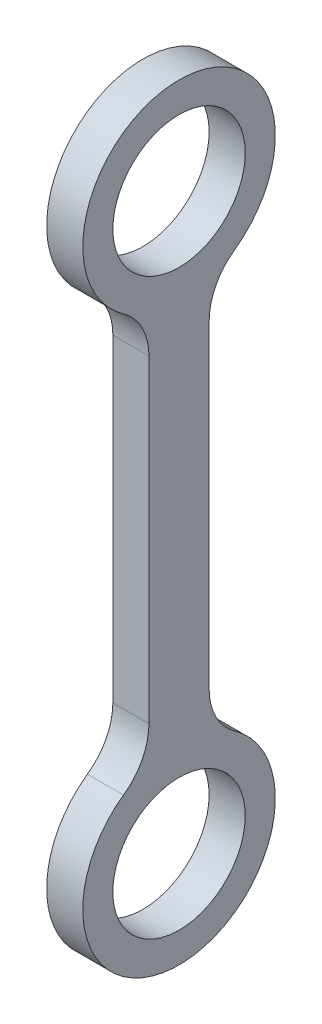
ISO-10303-21;
HEADER;
FILE_DESCRIPTION(('STEP AP214'),'2;1');
FILE_NAME('part.step','',(''),(''),'','','');
FILE_SCHEMA(('AUTOMOTIVE_DESIGN { 1 0 10303 214 1 1 1 1 }'));
ENDSEC;
DATA;
#1=APPLICATION_CONTEXT('core data for automotive mechanical design processes');
#2=APPLICATION_PROTOCOL_DEFINITION('international standard','automotive_design',2000,#1);
#3=PRODUCT_CONTEXT('',#1,'mechanical');
#4=PRODUCT('Part','Part','',(#3));
#5=PRODUCT_RELATED_PRODUCT_CATEGORY('part','',(#4));
#6=PRODUCT_DEFINITION_FORMATION('','',#4);
#7=PRODUCT_DEFINITION_CONTEXT('part definition',#1,'design');
#8=PRODUCT_DEFINITION('design','',#6,#7);
#9=PRODUCT_DEFINITION_SHAPE('','',#8);
#10=(LENGTH_UNIT() NAMED_UNIT(*) SI_UNIT(.MILLI.,.METRE.));
#11=(NAMED_UNIT(*) PLANE_ANGLE_UNIT() SI_UNIT($,.RADIAN.));
#12=(NAMED_UNIT(*) SI_UNIT($,.STERADIAN.) SOLID_ANGLE_UNIT());
#13=UNCERTAINTY_MEASURE_WITH_UNIT(LENGTH_MEASURE(1.E-05),#10,'distance_accuracy_value','');
#14=(GEOMETRIC_REPRESENTATION_CONTEXT(3) GLOBAL_UNCERTAINTY_ASSIGNED_CONTEXT((#13)) GLOBAL_UNIT_ASSIGNED_CONTEXT((#10,
#11,#12)) REPRESENTATION_CONTEXT('',''));
#15=CARTESIAN_POINT('',(0.,0.,0.));
#16=DIRECTION('',(0.,0.,1.));
#17=DIRECTION('',(1.,0.,0.));
#18=AXIS2_PLACEMENT_3D('',#15,#16,#17);
#19=CARTESIAN_POINT('',(-3.,0.,0.));
#20=DIRECTION('',(1.,0.,0.));
#21=DIRECTION('',(0.,0.,-1.));
#22=AXIS2_PLACEMENT_3D('',#19,#20,#21);
#23=CYLINDRICAL_SURFACE('',#22,16.);
#24=CARTESIAN_POINT('',(3.,0.,0.));
#25=DIRECTION('',(1.,0.,0.));
#26=DIRECTION('',(0.,0.,-1.));
#27=AXIS2_PLACEMENT_3D('',#24,#25,#26);
#28=CIRCLE('',#27,16.);
#29=CARTESIAN_POINT('',(3.,-13.0687757425202,-9.23076923076924));
#30=VERTEX_POINT('',#29);
#31=CARTESIAN_POINT('',(3.,-13.0687757425202,9.23076923076924));
#32=VERTEX_POINT('',#31);
#33=EDGE_CURVE('E157',#30,#32,#28,.T.);
#34=ORIENTED_EDGE('',*,*,#33,.F.);
#35=DIRECTION('',(1.,0.,0.));
#36=VECTOR('',#35,1.);
#37=CARTESIAN_POINT('',(-3.,-13.0687757425202,-9.23076923076924));
#38=LINE('',#37,#36);
#39=CARTESIAN_POINT('',(-3.,-13.0687757425202,-9.23076923076924));
#40=VERTEX_POINT('',#39);
#41=EDGE_CURVE('E56',#30,#40,#38,.F.);
#42=ORIENTED_EDGE('',*,*,#41,.T.);
#43=CARTESIAN_POINT('',(-3.,0.,0.));
#44=DIRECTION('',(1.,0.,0.));
#45=DIRECTION('',(0.,0.,-1.));
#46=AXIS2_PLACEMENT_3D('',#43,#44,#45);
#47=CIRCLE('',#46,16.);
#48=CARTESIAN_POINT('',(-3.,-13.0687757425202,9.23076923076924));
#49=VERTEX_POINT('',#48);
#50=EDGE_CURVE('E165',#40,#49,#47,.T.);
#51=ORIENTED_EDGE('',*,*,#50,.T.);
#52=DIRECTION('',(1.,0.,0.));
#53=VECTOR('',#52,1.);
#54=CARTESIAN_POINT('',(-3.,-13.0687757425202,9.23076923076924));
#55=LINE('',#54,#53);
#56=EDGE_CURVE('E145',#49,#32,#55,.T.);
#57=ORIENTED_EDGE('',*,*,#56,.T.);
#58=EDGE_LOOP('',(#34,#42,#51,#57));
#59=FACE_BOUND('',#58,.T.);
#60=ADVANCED_FACE('F36',(#59),#23,.T.);
#61=CARTESIAN_POINT('',(-3.,-15.1986841535707,-5.00000000000001));
#62=DIRECTION('',(0.,0.,-1.));
#63=DIRECTION('',(0.,1.,0.));
#64=AXIS2_PLACEMENT_3D('',#61,#62,#63);
#65=PLANE('',#64);
#66=DIRECTION('',(0.,1.,0.));
#67=VECTOR('',#66,1.);
#68=CARTESIAN_POINT('',(3.,-15.1986841535707,-5.00000000000001));
#69=LINE('',#68,#67);
#70=CARTESIAN_POINT('',(3.,-74.160607725546,-5.));
#71=VERTEX_POINT('',#70);
#72=CARTESIAN_POINT('',(3.,-21.2367605815953,-5.00000000000001));
#73=VERTEX_POINT('',#72);
#74=EDGE_CURVE('E124',#71,#73,#69,.T.);
#75=ORIENTED_EDGE('',*,*,#74,.F.);
#76=DIRECTION('',(-1.,0.,0.));
#77=VECTOR('',#76,1.);
#78=CARTESIAN_POINT('',(-3.,-74.160607725546,-5.));
#79=LINE('',#78,#77);
#80=CARTESIAN_POINT('',(-3.,-74.160607725546,-5.));
#81=VERTEX_POINT('',#80);
#82=EDGE_CURVE('E139',#71,#81,#79,.T.);
#83=ORIENTED_EDGE('',*,*,#82,.T.);
#84=DIRECTION('',(0.,1.,0.));
#85=VECTOR('',#84,1.);
#86=CARTESIAN_POINT('',(-3.,-15.1986841535707,-5.00000000000001));
#87=LINE('',#86,#85);
#88=CARTESIAN_POINT('',(-3.,-21.2367605815953,-5.00000000000001));
#89=VERTEX_POINT('',#88);
#90=EDGE_CURVE('E128',#81,#89,#87,.T.);
#91=ORIENTED_EDGE('',*,*,#90,.T.);
#92=DIRECTION('',(-1.,0.,0.));
#93=VECTOR('',#92,1.);
#94=CARTESIAN_POINT('',(3.,-21.2367605815953,-5.00000000000001));
#95=LINE('',#94,#93);
#96=EDGE_CURVE('E130',#89,#73,#95,.F.);
#97=ORIENTED_EDGE('',*,*,#96,.T.);
#98=EDGE_LOOP('',(#75,#83,#91,#97));
#99=FACE_BOUND('',#98,.T.);
#100=ADVANCED_FACE('F181',(#99),#65,.T.);
#101=CARTESIAN_POINT('',(-3.,-95.3973683071413,0.));
#102=DIRECTION('',(1.,0.,0.));
#103=DIRECTION('',(0.,0.,-1.));
#104=AXIS2_PLACEMENT_3D('',#101,#102,#103);
#105=CYLINDRICAL_SURFACE('',#104,16.);
#106=CARTESIAN_POINT('',(-3.,-95.3973683071413,0.));
#107=DIRECTION('',(1.,0.,0.));
#108=DIRECTION('',(0.,0.,-1.));
#109=AXIS2_PLACEMENT_3D('',#106,#107,#108);
#110=CIRCLE('',#109,16.);
#111=CARTESIAN_POINT('',(-3.,-82.3285925646211,9.23076923076924));
#112=VERTEX_POINT('',#111);
#113=CARTESIAN_POINT('',(-3.,-82.3285925646211,-9.23076923076923));
#114=VERTEX_POINT('',#113);
#115=EDGE_CURVE('E133',#112,#114,#110,.T.);
#116=ORIENTED_EDGE('',*,*,#115,.T.);
#117=DIRECTION('',(1.,0.,0.));
#118=VECTOR('',#117,1.);
#119=CARTESIAN_POINT('',(-3.,-82.3285925646211,-9.23076923076923));
#120=LINE('',#119,#118);
#121=CARTESIAN_POINT('',(3.,-82.3285925646211,-9.23076923076923));
#122=VERTEX_POINT('',#121);
#123=EDGE_CURVE('E123',#114,#122,#120,.T.);
#124=ORIENTED_EDGE('',*,*,#123,.T.);
#125=CARTESIAN_POINT('',(3.,-95.3973683071413,0.));
#126=DIRECTION('',(1.,0.,0.));
#127=DIRECTION('',(0.,0.,-1.));
#128=AXIS2_PLACEMENT_3D('',#125,#126,#127);
#129=CIRCLE('',#128,16.);
#130=CARTESIAN_POINT('',(3.,-82.3285925646211,9.23076923076924));
#131=VERTEX_POINT('',#130);
#132=EDGE_CURVE('E106',#131,#122,#129,.T.);
#133=ORIENTED_EDGE('',*,*,#132,.F.);
#134=DIRECTION('',(1.,0.,0.));
#135=VECTOR('',#134,1.);
#136=CARTESIAN_POINT('',(-3.,-82.3285925646211,9.23076923076924));
#137=LINE('',#136,#135);
#138=EDGE_CURVE('E120',#131,#112,#137,.F.);
#139=ORIENTED_EDGE('',*,*,#138,.T.);
#140=EDGE_LOOP('',(#116,#124,#133,#139));
#141=FACE_BOUND('',#140,.T.);
#142=ADVANCED_FACE('F119',(#141),#105,.T.);
#143=CARTESIAN_POINT('',(-3.,-15.1986841535707,5.00000000000001));
#144=DIRECTION('',(0.,0.,1.));
#145=DIRECTION('',(0.,-1.,0.));
#146=AXIS2_PLACEMENT_3D('',#143,#144,#145);
#147=PLANE('',#146);
#148=DIRECTION('',(0.,-1.,0.));
#149=VECTOR('',#148,1.);
#150=CARTESIAN_POINT('',(-3.,-15.1986841535707,5.00000000000001));
#151=LINE('',#150,#149);
#152=CARTESIAN_POINT('',(-3.,-21.2367605815953,5.00000000000001));
#153=VERTEX_POINT('',#152);
#154=CARTESIAN_POINT('',(-3.,-74.160607725546,5.00000000000001));
#155=VERTEX_POINT('',#154);
#156=EDGE_CURVE('E167',#153,#155,#151,.T.);
#157=ORIENTED_EDGE('',*,*,#156,.T.);
#158=DIRECTION('',(-1.,0.,0.));
#159=VECTOR('',#158,1.);
#160=CARTESIAN_POINT('',(3.,-74.160607725546,5.00000000000001));
#161=LINE('',#160,#159);
#162=CARTESIAN_POINT('',(3.,-74.160607725546,5.00000000000001));
#163=VERTEX_POINT('',#162);
#164=EDGE_CURVE('E143',#155,#163,#161,.F.);
#165=ORIENTED_EDGE('',*,*,#164,.T.);
#166=DIRECTION('',(0.,-1.,0.));
#167=VECTOR('',#166,1.);
#168=CARTESIAN_POINT('',(3.,-15.1986841535707,5.00000000000001));
#169=LINE('',#168,#167);
#170=CARTESIAN_POINT('',(3.,-21.2367605815953,5.00000000000001));
#171=VERTEX_POINT('',#170);
#172=EDGE_CURVE('E108',#171,#163,#169,.T.);
#173=ORIENTED_EDGE('',*,*,#172,.F.);
#174=DIRECTION('',(-1.,0.,0.));
#175=VECTOR('',#174,1.);
#176=CARTESIAN_POINT('',(-3.,-21.2367605815953,5.00000000000001));
#177=LINE('',#176,#175);
#178=EDGE_CURVE('E141',#171,#153,#177,.T.);
#179=ORIENTED_EDGE('',*,*,#178,.T.);
#180=EDGE_LOOP('',(#157,#165,#173,#179));
#181=FACE_BOUND('',#180,.T.);
#182=ADVANCED_FACE('F163',(#181),#147,.T.);
#183=CARTESIAN_POINT('',(-3.,0.,0.));
#184=DIRECTION('',(1.,0.,0.));
#185=DIRECTION('',(0.,0.,-1.));
#186=AXIS2_PLACEMENT_3D('',#183,#184,#185);
#187=PLANE('',#186);
#188=CARTESIAN_POINT('',(-3.,-95.3973683071413,0.));
#189=DIRECTION('',(1.,0.,0.));
#190=DIRECTION('',(0.,0.,-1.));
#191=AXIS2_PLACEMENT_3D('',#188,#189,#190);
#192=CIRCLE('',#191,11.);
#193=CARTESIAN_POINT('',(-3.,-95.3973683071413,-11.));
#194=VERTEX_POINT('',#193);
#195=EDGE_CURVE('E172',#194,#194,#192,.T.);
#196=ORIENTED_EDGE('',*,*,#195,.T.);
#197=EDGE_LOOP('',(#196));
#198=FACE_BOUND('',#197,.T.);
#199=CARTESIAN_POINT('',(-3.,0.,0.));
#200=DIRECTION('',(1.,0.,0.));
#201=DIRECTION('',(0.,0.,-1.));
#202=AXIS2_PLACEMENT_3D('',#199,#200,#201);
#203=CIRCLE('',#202,11.);
#204=CARTESIAN_POINT('',(-3.,0.,-11.));
#205=VERTEX_POINT('',#204);
#206=EDGE_CURVE('E168',#205,#205,#203,.T.);
#207=ORIENTED_EDGE('',*,*,#206,.T.);
#208=EDGE_LOOP('',(#207));
#209=FACE_BOUND('',#208,.T.);
#210=ORIENTED_EDGE('',*,*,#50,.F.);
#211=CARTESIAN_POINT('',(-3.,-21.2367605815953,-15.));
#212=DIRECTION('',(1.,0.,0.));
#213=DIRECTION('',(0.,0.,-1.));
#214=AXIS2_PLACEMENT_3D('',#211,#212,#213);
#215=CIRCLE('',#214,10.);
#216=EDGE_CURVE('E155',#40,#89,#215,.T.);
#217=ORIENTED_EDGE('',*,*,#216,.T.);
#218=ORIENTED_EDGE('',*,*,#90,.F.);
#219=CARTESIAN_POINT('',(-3.,-74.160607725546,-15.));
#220=DIRECTION('',(1.,0.,0.));
#221=DIRECTION('',(0.,0.,-1.));
#222=AXIS2_PLACEMENT_3D('',#219,#220,#221);
#223=CIRCLE('',#222,10.);
#224=EDGE_CURVE('E114',#81,#114,#223,.T.);
#225=ORIENTED_EDGE('',*,*,#224,.T.);
#226=ORIENTED_EDGE('',*,*,#115,.F.);
#227=CARTESIAN_POINT('',(-3.,-74.160607725546,15.));
#228=DIRECTION('',(1.,0.,0.));
#229=DIRECTION('',(0.,0.,-1.));
#230=AXIS2_PLACEMENT_3D('',#227,#228,#229);
#231=CIRCLE('',#230,10.);
#232=EDGE_CURVE('E113',#112,#155,#231,.T.);
#233=ORIENTED_EDGE('',*,*,#232,.T.);
#234=ORIENTED_EDGE('',*,*,#156,.F.);
#235=CARTESIAN_POINT('',(-3.,-21.2367605815953,15.));
#236=DIRECTION('',(1.,0.,0.));
#237=DIRECTION('',(0.,0.,-1.));
#238=AXIS2_PLACEMENT_3D('',#235,#236,#237);
#239=CIRCLE('',#238,10.);
#240=EDGE_CURVE('E11',#153,#49,#239,.T.);
#241=ORIENTED_EDGE('',*,*,#240,.T.);
#242=EDGE_LOOP('',(#210,#217,#218,#225,#226,#233,#234,#241));
#243=FACE_BOUND('',#242,.T.);
#244=ADVANCED_FACE('F224',(#198,#209,#243),#187,.F.);
#245=CARTESIAN_POINT('',(-3.,0.,0.));
#246=DIRECTION('',(1.,0.,0.));
#247=DIRECTION('',(0.,0.,-1.));
#248=AXIS2_PLACEMENT_3D('',#245,#246,#247);
#249=CYLINDRICAL_SURFACE('',#248,11.);
#250=ORIENTED_EDGE('',*,*,#206,.F.);
#251=EDGE_LOOP('',(#250));
#252=FACE_BOUND('',#251,.T.);
#253=CARTESIAN_POINT('',(3.,0.,0.));
#254=DIRECTION('',(1.,0.,0.));
#255=DIRECTION('',(0.,0.,-1.));
#256=AXIS2_PLACEMENT_3D('',#253,#254,#255);
#257=CIRCLE('',#256,11.);
#258=CARTESIAN_POINT('',(3.,0.,-11.));
#259=VERTEX_POINT('',#258);
#260=EDGE_CURVE('E188',#259,#259,#257,.T.);
#261=ORIENTED_EDGE('',*,*,#260,.T.);
#262=EDGE_LOOP('',(#261));
#263=FACE_BOUND('',#262,.T.);
#264=ADVANCED_FACE('F204',(#252,#263),#249,.F.);
#265=CARTESIAN_POINT('',(-3.,-95.3973683071413,0.));
#266=DIRECTION('',(1.,0.,0.));
#267=DIRECTION('',(0.,0.,-1.));
#268=AXIS2_PLACEMENT_3D('',#265,#266,#267);
#269=CYLINDRICAL_SURFACE('',#268,11.);
#270=ORIENTED_EDGE('',*,*,#195,.F.);
#271=EDGE_LOOP('',(#270));
#272=FACE_BOUND('',#271,.T.);
#273=CARTESIAN_POINT('',(3.,-95.3973683071413,0.));
#274=DIRECTION('',(1.,0.,0.));
#275=DIRECTION('',(0.,0.,-1.));
#276=AXIS2_PLACEMENT_3D('',#273,#274,#275);
#277=CIRCLE('',#276,11.);
#278=CARTESIAN_POINT('',(3.,-95.3973683071413,-11.));
#279=VERTEX_POINT('',#278);
#280=EDGE_CURVE('E191',#279,#279,#277,.T.);
#281=ORIENTED_EDGE('',*,*,#280,.T.);
#282=EDGE_LOOP('',(#281));
#283=FACE_BOUND('',#282,.T.);
#284=ADVANCED_FACE('F195',(#272,#283),#269,.F.);
#285=CARTESIAN_POINT('',(3.,0.,0.));
#286=DIRECTION('',(1.,0.,0.));
#287=DIRECTION('',(0.,0.,-1.));
#288=AXIS2_PLACEMENT_3D('',#285,#286,#287);
#289=PLANE('',#288);
#290=ORIENTED_EDGE('',*,*,#260,.F.);
#291=EDGE_LOOP('',(#290));
#292=FACE_BOUND('',#291,.T.);
#293=ORIENTED_EDGE('',*,*,#74,.T.);
#294=CARTESIAN_POINT('',(3.,-21.2367605815953,-15.));
#295=DIRECTION('',(1.,0.,0.));
#296=DIRECTION('',(0.,0.,-1.));
#297=AXIS2_PLACEMENT_3D('',#294,#295,#296);
#298=CIRCLE('',#297,10.);
#299=EDGE_CURVE('E153',#73,#30,#298,.F.);
#300=ORIENTED_EDGE('',*,*,#299,.T.);
#301=ORIENTED_EDGE('',*,*,#33,.T.);
#302=CARTESIAN_POINT('',(3.,-21.2367605815953,15.));
#303=DIRECTION('',(1.,0.,0.));
#304=DIRECTION('',(0.,0.,-1.));
#305=AXIS2_PLACEMENT_3D('',#302,#303,#304);
#306=CIRCLE('',#305,10.);
#307=EDGE_CURVE('E44',#32,#171,#306,.F.);
#308=ORIENTED_EDGE('',*,*,#307,.T.);
#309=ORIENTED_EDGE('',*,*,#172,.T.);
#310=CARTESIAN_POINT('',(3.,-74.160607725546,15.));
#311=DIRECTION('',(1.,0.,0.));
#312=DIRECTION('',(0.,0.,-1.));
#313=AXIS2_PLACEMENT_3D('',#310,#311,#312);
#314=CIRCLE('',#313,10.);
#315=EDGE_CURVE('E101',#163,#131,#314,.F.);
#316=ORIENTED_EDGE('',*,*,#315,.T.);
#317=ORIENTED_EDGE('',*,*,#132,.T.);
#318=CARTESIAN_POINT('',(3.,-74.160607725546,-15.));
#319=DIRECTION('',(1.,0.,0.));
#320=DIRECTION('',(0.,0.,-1.));
#321=AXIS2_PLACEMENT_3D('',#318,#319,#320);
#322=CIRCLE('',#321,10.);
#323=EDGE_CURVE('E149',#122,#71,#322,.F.);
#324=ORIENTED_EDGE('',*,*,#323,.T.);
#325=EDGE_LOOP('',(#293,#300,#301,#308,#309,#316,#317,#324));
#326=FACE_BOUND('',#325,.T.);
#327=ORIENTED_EDGE('',*,*,#280,.F.);
#328=EDGE_LOOP('',(#327));
#329=FACE_BOUND('',#328,.T.);
#330=ADVANCED_FACE('F104',(#292,#326,#329),#289,.T.);
#331=CARTESIAN_POINT('',(-3.,-74.160607725546,-15.));
#332=DIRECTION('',(1.,0.,0.));
#333=DIRECTION('',(0.,0.,-1.));
#334=AXIS2_PLACEMENT_3D('',#331,#332,#333);
#335=CYLINDRICAL_SURFACE('',#334,10.);
#336=ORIENTED_EDGE('',*,*,#224,.F.);
#337=ORIENTED_EDGE('',*,*,#82,.F.);
#338=ORIENTED_EDGE('',*,*,#323,.F.);
#339=ORIENTED_EDGE('',*,*,#123,.F.);
#340=EDGE_LOOP('',(#336,#337,#338,#339));
#341=FACE_BOUND('',#340,.T.);
#342=ADVANCED_FACE('F177',(#341),#335,.F.);
#343=CARTESIAN_POINT('',(-3.,-74.160607725546,15.));
#344=DIRECTION('',(1.,0.,0.));
#345=DIRECTION('',(0.,0.,-1.));
#346=AXIS2_PLACEMENT_3D('',#343,#344,#345);
#347=CYLINDRICAL_SURFACE('',#346,10.);
#348=ORIENTED_EDGE('',*,*,#232,.F.);
#349=ORIENTED_EDGE('',*,*,#138,.F.);
#350=ORIENTED_EDGE('',*,*,#315,.F.);
#351=ORIENTED_EDGE('',*,*,#164,.F.);
#352=EDGE_LOOP('',(#348,#349,#350,#351));
#353=FACE_BOUND('',#352,.T.);
#354=ADVANCED_FACE('F127',(#353),#347,.F.);
#355=CARTESIAN_POINT('',(-3.,-21.2367605815953,-15.));
#356=DIRECTION('',(1.,0.,0.));
#357=DIRECTION('',(0.,0.,-1.));
#358=AXIS2_PLACEMENT_3D('',#355,#356,#357);
#359=CYLINDRICAL_SURFACE('',#358,10.);
#360=ORIENTED_EDGE('',*,*,#216,.F.);
#361=ORIENTED_EDGE('',*,*,#41,.F.);
#362=ORIENTED_EDGE('',*,*,#299,.F.);
#363=ORIENTED_EDGE('',*,*,#96,.F.);
#364=EDGE_LOOP('',(#360,#361,#362,#363));
#365=FACE_BOUND('',#364,.T.);
#366=ADVANCED_FACE('F218',(#365),#359,.F.);
#367=CARTESIAN_POINT('',(-3.,-21.2367605815953,15.));
#368=DIRECTION('',(1.,0.,0.));
#369=DIRECTION('',(0.,0.,-1.));
#370=AXIS2_PLACEMENT_3D('',#367,#368,#369);
#371=CYLINDRICAL_SURFACE('',#370,10.);
#372=ORIENTED_EDGE('',*,*,#240,.F.);
#373=ORIENTED_EDGE('',*,*,#178,.F.);
#374=ORIENTED_EDGE('',*,*,#307,.F.);
#375=ORIENTED_EDGE('',*,*,#56,.F.);
#376=EDGE_LOOP('',(#372,#373,#374,#375));
#377=FACE_BOUND('',#376,.T.);
#378=ADVANCED_FACE('F38',(#377),#371,.F.);
#379=CLOSED_SHELL('',(#60,#100,#142,#182,#244,#264,#284,#330,#342,#354,#366,#378));
#380=MANIFOLD_SOLID_BREP('B2',#379);
#381=ADVANCED_BREP_SHAPE_REPRESENTATION('',(#18,#380),#14);
#382=SHAPE_DEFINITION_REPRESENTATION(#9,#381);
ENDSEC;
END-ISO-10303-21;
